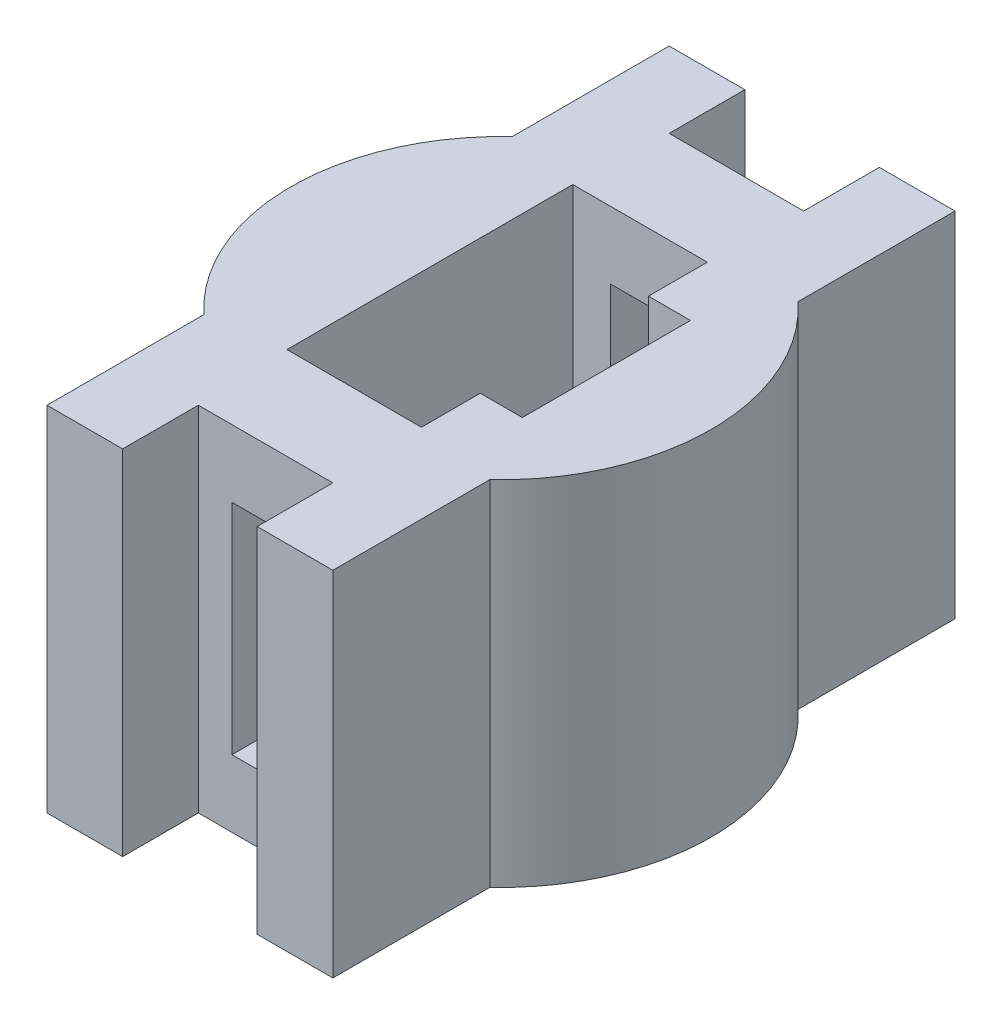
ISO-10303-21;
HEADER;
FILE_DESCRIPTION(('STEP AP214'),'2;1');
FILE_NAME('part.step','',(''),(''),'','','');
FILE_SCHEMA(('AUTOMOTIVE_DESIGN { 1 0 10303 214 1 1 1 1 }'));
ENDSEC;
DATA;
#1=APPLICATION_CONTEXT('core data for automotive mechanical design processes');
#2=APPLICATION_PROTOCOL_DEFINITION('international standard','automotive_design',2000,#1);
#3=PRODUCT_CONTEXT('',#1,'mechanical');
#4=PRODUCT('Part','Part','',(#3));
#5=PRODUCT_RELATED_PRODUCT_CATEGORY('part','',(#4));
#6=PRODUCT_DEFINITION_FORMATION('','',#4);
#7=PRODUCT_DEFINITION_CONTEXT('part definition',#1,'design');
#8=PRODUCT_DEFINITION('design','',#6,#7);
#9=PRODUCT_DEFINITION_SHAPE('','',#8);
#10=(LENGTH_UNIT() NAMED_UNIT(*) SI_UNIT(.MILLI.,.METRE.));
#11=(NAMED_UNIT(*) PLANE_ANGLE_UNIT() SI_UNIT($,.RADIAN.));
#12=(NAMED_UNIT(*) SI_UNIT($,.STERADIAN.) SOLID_ANGLE_UNIT());
#13=UNCERTAINTY_MEASURE_WITH_UNIT(LENGTH_MEASURE(1.E-05),#10,'distance_accuracy_value','');
#14=(GEOMETRIC_REPRESENTATION_CONTEXT(3) GLOBAL_UNCERTAINTY_ASSIGNED_CONTEXT((#13)) GLOBAL_UNIT_ASSIGNED_CONTEXT((#10,
#11,#12)) REPRESENTATION_CONTEXT('',''));
#15=CARTESIAN_POINT('',(0.,0.,0.));
#16=DIRECTION('',(0.,0.,1.));
#17=DIRECTION('',(1.,0.,0.));
#18=AXIS2_PLACEMENT_3D('',#15,#16,#17);
#19=CARTESIAN_POINT('',(0.,0.,37.));
#20=DIRECTION('',(1.,0.,0.));
#21=DIRECTION('',(0.,0.,-1.));
#22=AXIS2_PLACEMENT_3D('',#19,#20,#21);
#23=PLANE('',#22);
#24=DIRECTION('',(0.,-1.,0.));
#25=VECTOR('',#24,1.);
#26=CARTESIAN_POINT('',(0.,42.,18.3303027798234));
#27=LINE('',#26,#25);
#28=CARTESIAN_POINT('',(0.,0.,18.3303027798234));
#29=VERTEX_POINT('',#28);
#30=CARTESIAN_POINT('',(0.,42.,18.3303027798234));
#31=VERTEX_POINT('',#30);
#32=EDGE_CURVE('E376',#29,#31,#27,.F.);
#33=ORIENTED_EDGE('',*,*,#32,.F.);
#34=DIRECTION('',(0.,0.,-1.));
#35=VECTOR('',#34,1.);
#36=CARTESIAN_POINT('',(0.,0.,37.));
#37=LINE('',#36,#35);
#38=CARTESIAN_POINT('',(0.,0.,37.));
#39=VERTEX_POINT('',#38);
#40=EDGE_CURVE('E465',#39,#29,#37,.T.);
#41=ORIENTED_EDGE('',*,*,#40,.F.);
#42=DIRECTION('',(0.,-1.,0.));
#43=VECTOR('',#42,1.);
#44=CARTESIAN_POINT('',(0.,0.,37.));
#45=LINE('',#44,#43);
#46=CARTESIAN_POINT('',(0.,42.,37.));
#47=VERTEX_POINT('',#46);
#48=EDGE_CURVE('E427',#47,#39,#45,.T.);
#49=ORIENTED_EDGE('',*,*,#48,.F.);
#50=DIRECTION('',(0.,0.,-1.));
#51=VECTOR('',#50,1.);
#52=CARTESIAN_POINT('',(0.,42.,37.));
#53=LINE('',#52,#51);
#54=EDGE_CURVE('E454',#47,#31,#53,.T.);
#55=ORIENTED_EDGE('',*,*,#54,.T.);
#56=EDGE_LOOP('',(#33,#41,#49,#55));
#57=FACE_BOUND('',#56,.T.);
#58=ADVANCED_FACE('F37',(#57),#23,.F.);
#59=DIRECTION('',(0.,-1.,0.));
#60=VECTOR('',#59,1.);
#61=CARTESIAN_POINT('',(0.,42.,-18.3303027798234));
#62=LINE('',#61,#60);
#63=CARTESIAN_POINT('',(0.,42.,-18.3303027798234));
#64=VERTEX_POINT('',#63);
#65=CARTESIAN_POINT('',(0.,0.,-18.3303027798234));
#66=VERTEX_POINT('',#65);
#67=EDGE_CURVE('E373',#64,#66,#62,.T.);
#68=ORIENTED_EDGE('',*,*,#67,.F.);
#69=CARTESIAN_POINT('',(0.,42.,-37.));
#70=VERTEX_POINT('',#69);
#71=EDGE_CURVE('E441',#64,#70,#53,.T.);
#72=ORIENTED_EDGE('',*,*,#71,.T.);
#73=DIRECTION('',(0.,-1.,0.));
#74=VECTOR('',#73,1.);
#75=CARTESIAN_POINT('',(0.,0.,-37.));
#76=LINE('',#75,#74);
#77=CARTESIAN_POINT('',(0.,0.,-37.));
#78=VERTEX_POINT('',#77);
#79=EDGE_CURVE('E420',#70,#78,#76,.T.);
#80=ORIENTED_EDGE('',*,*,#79,.T.);
#81=EDGE_CURVE('E464',#66,#78,#37,.T.);
#82=ORIENTED_EDGE('',*,*,#81,.F.);
#83=EDGE_LOOP('',(#68,#72,#80,#82));
#84=FACE_BOUND('',#83,.T.);
#85=ADVANCED_FACE('F509',(#84),#23,.F.);
#86=CARTESIAN_POINT('',(34.,0.,37.));
#87=DIRECTION('',(-1.,0.,0.));
#88=DIRECTION('',(0.,0.,1.));
#89=AXIS2_PLACEMENT_3D('',#86,#87,#88);
#90=PLANE('',#89);
#91=DIRECTION('',(0.,-1.,0.));
#92=VECTOR('',#91,1.);
#93=CARTESIAN_POINT('',(34.,42.,-18.3303027798234));
#94=LINE('',#93,#92);
#95=CARTESIAN_POINT('',(34.,0.,-18.3303027798234));
#96=VERTEX_POINT('',#95);
#97=CARTESIAN_POINT('',(34.,42.,-18.3303027798234));
#98=VERTEX_POINT('',#97);
#99=EDGE_CURVE('E370',#96,#98,#94,.F.);
#100=ORIENTED_EDGE('',*,*,#99,.F.);
#101=DIRECTION('',(0.,0.,-1.));
#102=VECTOR('',#101,1.);
#103=CARTESIAN_POINT('',(34.,0.,37.));
#104=LINE('',#103,#102);
#105=CARTESIAN_POINT('',(34.,0.,-37.));
#106=VERTEX_POINT('',#105);
#107=EDGE_CURVE('E461',#96,#106,#104,.T.);
#108=ORIENTED_EDGE('',*,*,#107,.T.);
#109=DIRECTION('',(0.,1.,0.));
#110=VECTOR('',#109,1.);
#111=CARTESIAN_POINT('',(34.,0.,-37.));
#112=LINE('',#111,#110);
#113=CARTESIAN_POINT('',(34.,42.,-37.));
#114=VERTEX_POINT('',#113);
#115=EDGE_CURVE('E448',#106,#114,#112,.T.);
#116=ORIENTED_EDGE('',*,*,#115,.T.);
#117=DIRECTION('',(0.,0.,-1.));
#118=VECTOR('',#117,1.);
#119=CARTESIAN_POINT('',(34.,42.,37.));
#120=LINE('',#119,#118);
#121=EDGE_CURVE('E457',#98,#114,#120,.T.);
#122=ORIENTED_EDGE('',*,*,#121,.F.);
#123=EDGE_LOOP('',(#100,#108,#116,#122));
#124=FACE_BOUND('',#123,.T.);
#125=ADVANCED_FACE('F514',(#124),#90,.F.);
#126=DIRECTION('',(0.,-1.,0.));
#127=VECTOR('',#126,1.);
#128=CARTESIAN_POINT('',(34.,42.,18.3303027798234));
#129=LINE('',#128,#127);
#130=CARTESIAN_POINT('',(34.,42.,18.3303027798234));
#131=VERTEX_POINT('',#130);
#132=CARTESIAN_POINT('',(34.,0.,18.3303027798234));
#133=VERTEX_POINT('',#132);
#134=EDGE_CURVE('E363',#131,#133,#129,.T.);
#135=ORIENTED_EDGE('',*,*,#134,.F.);
#136=CARTESIAN_POINT('',(34.,42.,37.));
#137=VERTEX_POINT('',#136);
#138=EDGE_CURVE('E458',#137,#131,#120,.T.);
#139=ORIENTED_EDGE('',*,*,#138,.F.);
#140=DIRECTION('',(0.,1.,0.));
#141=VECTOR('',#140,1.);
#142=CARTESIAN_POINT('',(34.,0.,37.));
#143=LINE('',#142,#141);
#144=CARTESIAN_POINT('',(34.,0.,37.));
#145=VERTEX_POINT('',#144);
#146=EDGE_CURVE('E435',#145,#137,#143,.T.);
#147=ORIENTED_EDGE('',*,*,#146,.F.);
#148=EDGE_CURVE('E462',#145,#133,#104,.T.);
#149=ORIENTED_EDGE('',*,*,#148,.T.);
#150=EDGE_LOOP('',(#135,#139,#147,#149));
#151=FACE_BOUND('',#150,.T.);
#152=ADVANCED_FACE('F571',(#151),#90,.F.);
#153=CARTESIAN_POINT('',(0.,0.,-37.));
#154=DIRECTION('',(0.,0.,-1.));
#155=DIRECTION('',(-1.,0.,0.));
#156=AXIS2_PLACEMENT_3D('',#153,#154,#155);
#157=PLANE('',#156);
#158=DIRECTION('',(0.,1.,0.));
#159=VECTOR('',#158,1.);
#160=CARTESIAN_POINT('',(9.,0.,-37.));
#161=LINE('',#160,#159);
#162=CARTESIAN_POINT('',(9.,0.,-37.));
#163=VERTEX_POINT('',#162);
#164=CARTESIAN_POINT('',(9.,42.,-37.));
#165=VERTEX_POINT('',#164);
#166=EDGE_CURVE('E382',#163,#165,#161,.T.);
#167=ORIENTED_EDGE('',*,*,#166,.F.);
#168=DIRECTION('',(1.,0.,0.));
#169=VECTOR('',#168,1.);
#170=CARTESIAN_POINT('',(0.,0.,-37.));
#171=LINE('',#170,#169);
#172=EDGE_CURVE('E445',#78,#163,#171,.T.);
#173=ORIENTED_EDGE('',*,*,#172,.F.);
#174=ORIENTED_EDGE('',*,*,#79,.F.);
#175=DIRECTION('',(-1.,0.,0.));
#176=VECTOR('',#175,1.);
#177=CARTESIAN_POINT('',(0.,42.,-37.));
#178=LINE('',#177,#176);
#179=EDGE_CURVE('E451',#165,#70,#178,.T.);
#180=ORIENTED_EDGE('',*,*,#179,.F.);
#181=EDGE_LOOP('',(#167,#173,#174,#180));
#182=FACE_BOUND('',#181,.T.);
#183=ADVANCED_FACE('F542',(#182),#157,.T.);
#184=CARTESIAN_POINT('',(0.,0.,37.));
#185=DIRECTION('',(0.,0.,-1.));
#186=DIRECTION('',(-1.,0.,0.));
#187=AXIS2_PLACEMENT_3D('',#184,#185,#186);
#188=PLANE('',#187);
#189=DIRECTION('',(-1.,0.,0.));
#190=VECTOR('',#189,1.);
#191=CARTESIAN_POINT('',(0.,42.,37.));
#192=LINE('',#191,#190);
#193=CARTESIAN_POINT('',(25.,42.,37.));
#194=VERTEX_POINT('',#193);
#195=EDGE_CURVE('E438',#137,#194,#192,.T.);
#196=ORIENTED_EDGE('',*,*,#195,.T.);
#197=DIRECTION('',(0.,1.,0.));
#198=VECTOR('',#197,1.);
#199=CARTESIAN_POINT('',(25.,0.,37.));
#200=LINE('',#199,#198);
#201=CARTESIAN_POINT('',(25.,0.,37.));
#202=VERTEX_POINT('',#201);
#203=EDGE_CURVE('E406',#202,#194,#200,.T.);
#204=ORIENTED_EDGE('',*,*,#203,.F.);
#205=DIRECTION('',(1.,0.,0.));
#206=VECTOR('',#205,1.);
#207=CARTESIAN_POINT('',(0.,0.,37.));
#208=LINE('',#207,#206);
#209=EDGE_CURVE('E430',#202,#145,#208,.T.);
#210=ORIENTED_EDGE('',*,*,#209,.T.);
#211=ORIENTED_EDGE('',*,*,#146,.T.);
#212=EDGE_LOOP('',(#196,#204,#210,#211));
#213=FACE_BOUND('',#212,.T.);
#214=ADVANCED_FACE('F576',(#213),#188,.F.);
#215=CARTESIAN_POINT('',(0.,0.,37.));
#216=DIRECTION('',(0.,1.,0.));
#217=DIRECTION('',(0.,0.,1.));
#218=AXIS2_PLACEMENT_3D('',#215,#216,#217);
#219=PLANE('',#218);
#220=DIRECTION('',(-1.,0.,0.));
#221=VECTOR('',#220,1.);
#222=CARTESIAN_POINT('',(24.5377617402465,0.,-17.));
#223=LINE('',#222,#221);
#224=CARTESIAN_POINT('',(24.5377617402465,0.,-17.));
#225=VERTEX_POINT('',#224);
#226=CARTESIAN_POINT('',(8.53776174024647,0.,-17.));
#227=VERTEX_POINT('',#226);
#228=EDGE_CURVE('E336',#225,#227,#223,.T.);
#229=ORIENTED_EDGE('',*,*,#228,.T.);
#230=DIRECTION('',(0.,0.,1.));
#231=VECTOR('',#230,1.);
#232=CARTESIAN_POINT('',(8.53776174024647,0.,17.));
#233=LINE('',#232,#231);
#234=CARTESIAN_POINT('',(8.53776174024647,0.,17.));
#235=VERTEX_POINT('',#234);
#236=EDGE_CURVE('E326',#227,#235,#233,.T.);
#237=ORIENTED_EDGE('',*,*,#236,.T.);
#238=DIRECTION('',(1.,0.,0.));
#239=VECTOR('',#238,1.);
#240=CARTESIAN_POINT('',(24.5377617402465,0.,17.));
#241=LINE('',#240,#239);
#242=CARTESIAN_POINT('',(24.5377617402465,0.,17.));
#243=VERTEX_POINT('',#242);
#244=EDGE_CURVE('E329',#235,#243,#241,.T.);
#245=ORIENTED_EDGE('',*,*,#244,.T.);
#246=DIRECTION('',(0.,0.,-1.));
#247=VECTOR('',#246,1.);
#248=CARTESIAN_POINT('',(24.5377617402465,0.,17.));
#249=LINE('',#248,#247);
#250=EDGE_CURVE('E333',#243,#225,#249,.T.);
#251=ORIENTED_EDGE('',*,*,#250,.T.);
#252=EDGE_LOOP('',(#229,#237,#245,#251));
#253=FACE_BOUND('',#252,.T.);
#254=ORIENTED_EDGE('',*,*,#40,.T.);
#255=CARTESIAN_POINT('',(17.,0.,0.));
#256=DIRECTION('',(0.,1.,0.));
#257=DIRECTION('',(0.,0.,1.));
#258=AXIS2_PLACEMENT_3D('',#255,#256,#257);
#259=CIRCLE('',#258,25.);
#260=EDGE_CURVE('E352',#66,#29,#259,.T.);
#261=ORIENTED_EDGE('',*,*,#260,.F.);
#262=ORIENTED_EDGE('',*,*,#81,.T.);
#263=ORIENTED_EDGE('',*,*,#172,.T.);
#264=DIRECTION('',(0.,0.,-1.));
#265=VECTOR('',#264,1.);
#266=CARTESIAN_POINT('',(9.,0.,-28.));
#267=LINE('',#266,#265);
#268=CARTESIAN_POINT('',(9.,0.,-28.));
#269=VERTEX_POINT('',#268);
#270=EDGE_CURVE('E397',#269,#163,#267,.T.);
#271=ORIENTED_EDGE('',*,*,#270,.F.);
#272=DIRECTION('',(-1.,0.,0.));
#273=VECTOR('',#272,1.);
#274=CARTESIAN_POINT('',(25.,0.,-28.));
#275=LINE('',#274,#273);
#276=CARTESIAN_POINT('',(25.,0.,-28.));
#277=VERTEX_POINT('',#276);
#278=EDGE_CURVE('E385',#277,#269,#275,.T.);
#279=ORIENTED_EDGE('',*,*,#278,.F.);
#280=DIRECTION('',(0.,0.,-1.));
#281=VECTOR('',#280,1.);
#282=CARTESIAN_POINT('',(25.,0.,-28.));
#283=LINE('',#282,#281);
#284=CARTESIAN_POINT('',(25.,0.,-37.));
#285=VERTEX_POINT('',#284);
#286=EDGE_CURVE('E399',#277,#285,#283,.T.);
#287=ORIENTED_EDGE('',*,*,#286,.T.);
#288=EDGE_CURVE('E444',#285,#106,#171,.T.);
#289=ORIENTED_EDGE('',*,*,#288,.T.);
#290=ORIENTED_EDGE('',*,*,#107,.F.);
#291=EDGE_CURVE('E365',#133,#96,#259,.T.);
#292=ORIENTED_EDGE('',*,*,#291,.F.);
#293=ORIENTED_EDGE('',*,*,#148,.F.);
#294=ORIENTED_EDGE('',*,*,#209,.F.);
#295=DIRECTION('',(0.,0.,1.));
#296=VECTOR('',#295,1.);
#297=CARTESIAN_POINT('',(25.,0.,28.));
#298=LINE('',#297,#296);
#299=CARTESIAN_POINT('',(25.,0.,28.));
#300=VERTEX_POINT('',#299);
#301=EDGE_CURVE('E421',#300,#202,#298,.T.);
#302=ORIENTED_EDGE('',*,*,#301,.F.);
#303=DIRECTION('',(1.,0.,0.));
#304=VECTOR('',#303,1.);
#305=CARTESIAN_POINT('',(9.00000000000001,0.,28.));
#306=LINE('',#305,#304);
#307=CARTESIAN_POINT('',(9.00000000000001,0.,28.));
#308=VERTEX_POINT('',#307);
#309=EDGE_CURVE('E409',#308,#300,#306,.T.);
#310=ORIENTED_EDGE('',*,*,#309,.F.);
#311=DIRECTION('',(0.,0.,1.));
#312=VECTOR('',#311,1.);
#313=CARTESIAN_POINT('',(9.00000000000001,0.,28.));
#314=LINE('',#313,#312);
#315=CARTESIAN_POINT('',(9.00000000000001,0.,37.));
#316=VERTEX_POINT('',#315);
#317=EDGE_CURVE('E423',#308,#316,#314,.T.);
#318=ORIENTED_EDGE('',*,*,#317,.T.);
#319=EDGE_CURVE('E432',#39,#316,#208,.T.);
#320=ORIENTED_EDGE('',*,*,#319,.F.);
#321=EDGE_LOOP('',(#254,#261,#262,#263,#271,#279,#287,#289,#290,#292,#293,#294,#302,#310,#318,#320));
#322=FACE_BOUND('',#321,.T.);
#323=ADVANCED_FACE('F523',(#253,#322),#219,.F.);
#324=CARTESIAN_POINT('',(0.,42.,37.));
#325=DIRECTION('',(0.,-1.,0.));
#326=DIRECTION('',(0.,0.,-1.));
#327=AXIS2_PLACEMENT_3D('',#324,#325,#326);
#328=PLANE('',#327);
#329=DIRECTION('',(0.,0.,-1.));
#330=VECTOR('',#329,1.);
#331=CARTESIAN_POINT('',(29.5377617402465,42.,10.));
#332=LINE('',#331,#330);
#333=CARTESIAN_POINT('',(29.5377617402465,42.,10.));
#334=VERTEX_POINT('',#333);
#335=CARTESIAN_POINT('',(29.5377617402465,42.,-10.));
#336=VERTEX_POINT('',#335);
#337=EDGE_CURVE('E298',#334,#336,#332,.T.);
#338=ORIENTED_EDGE('',*,*,#337,.F.);
#339=DIRECTION('',(-1.,0.,0.));
#340=VECTOR('',#339,1.);
#341=CARTESIAN_POINT('',(29.5377617402465,42.,10.));
#342=LINE('',#341,#340);
#343=CARTESIAN_POINT('',(24.5377617402465,42.,10.));
#344=VERTEX_POINT('',#343);
#345=EDGE_CURVE('E317',#334,#344,#342,.T.);
#346=ORIENTED_EDGE('',*,*,#345,.T.);
#347=DIRECTION('',(0.,0.,-1.));
#348=VECTOR('',#347,1.);
#349=CARTESIAN_POINT('',(24.5377617402465,42.,17.));
#350=LINE('',#349,#348);
#351=CARTESIAN_POINT('',(24.5377617402465,42.,17.));
#352=VERTEX_POINT('',#351);
#353=EDGE_CURVE('E345',#352,#344,#350,.T.);
#354=ORIENTED_EDGE('',*,*,#353,.F.);
#355=DIRECTION('',(1.,0.,0.));
#356=VECTOR('',#355,1.);
#357=CARTESIAN_POINT('',(24.5377617402465,42.,17.));
#358=LINE('',#357,#356);
#359=CARTESIAN_POINT('',(8.53776174024647,42.,17.));
#360=VERTEX_POINT('',#359);
#361=EDGE_CURVE('E341',#360,#352,#358,.T.);
#362=ORIENTED_EDGE('',*,*,#361,.F.);
#363=DIRECTION('',(0.,0.,1.));
#364=VECTOR('',#363,1.);
#365=CARTESIAN_POINT('',(8.53776174024647,42.,17.));
#366=LINE('',#365,#364);
#367=CARTESIAN_POINT('',(8.53776174024647,42.,-17.));
#368=VERTEX_POINT('',#367);
#369=EDGE_CURVE('E320',#368,#360,#366,.T.);
#370=ORIENTED_EDGE('',*,*,#369,.F.);
#371=DIRECTION('',(-1.,0.,0.));
#372=VECTOR('',#371,1.);
#373=CARTESIAN_POINT('',(24.5377617402465,42.,-17.));
#374=LINE('',#373,#372);
#375=CARTESIAN_POINT('',(24.5377617402465,42.,-17.));
#376=VERTEX_POINT('',#375);
#377=EDGE_CURVE('E330',#376,#368,#374,.T.);
#378=ORIENTED_EDGE('',*,*,#377,.F.);
#379=CARTESIAN_POINT('',(24.5377617402465,42.,-10.));
#380=VERTEX_POINT('',#379);
#381=EDGE_CURVE('E344',#380,#376,#350,.T.);
#382=ORIENTED_EDGE('',*,*,#381,.F.);
#383=DIRECTION('',(-1.,0.,0.));
#384=VECTOR('',#383,1.);
#385=CARTESIAN_POINT('',(29.5377617402465,42.,-10.));
#386=LINE('',#385,#384);
#387=EDGE_CURVE('E310',#336,#380,#386,.T.);
#388=ORIENTED_EDGE('',*,*,#387,.F.);
#389=EDGE_LOOP('',(#338,#346,#354,#362,#370,#378,#382,#388));
#390=FACE_BOUND('',#389,.T.);
#391=ORIENTED_EDGE('',*,*,#71,.F.);
#392=CARTESIAN_POINT('',(17.,42.,0.));
#393=DIRECTION('',(0.,1.,0.));
#394=DIRECTION('',(0.,0.,1.));
#395=AXIS2_PLACEMENT_3D('',#392,#393,#394);
#396=CIRCLE('',#395,25.);
#397=EDGE_CURVE('E364',#64,#31,#396,.T.);
#398=ORIENTED_EDGE('',*,*,#397,.T.);
#399=ORIENTED_EDGE('',*,*,#54,.F.);
#400=CARTESIAN_POINT('',(9.,42.,37.));
#401=VERTEX_POINT('',#400);
#402=EDGE_CURVE('E437',#401,#47,#192,.T.);
#403=ORIENTED_EDGE('',*,*,#402,.F.);
#404=DIRECTION('',(0.,0.,1.));
#405=VECTOR('',#404,1.);
#406=CARTESIAN_POINT('',(9.,42.,28.));
#407=LINE('',#406,#405);
#408=CARTESIAN_POINT('',(9.,42.,28.));
#409=VERTEX_POINT('',#408);
#410=EDGE_CURVE('E414',#409,#401,#407,.T.);
#411=ORIENTED_EDGE('',*,*,#410,.F.);
#412=DIRECTION('',(-1.,0.,0.));
#413=VECTOR('',#412,1.);
#414=CARTESIAN_POINT('',(25.,42.,28.));
#415=LINE('',#414,#413);
#416=CARTESIAN_POINT('',(25.,42.,28.));
#417=VERTEX_POINT('',#416);
#418=EDGE_CURVE('E403',#417,#409,#415,.T.);
#419=ORIENTED_EDGE('',*,*,#418,.F.);
#420=DIRECTION('',(0.,0.,1.));
#421=VECTOR('',#420,1.);
#422=CARTESIAN_POINT('',(25.,42.,28.));
#423=LINE('',#422,#421);
#424=EDGE_CURVE('E417',#417,#194,#423,.T.);
#425=ORIENTED_EDGE('',*,*,#424,.T.);
#426=ORIENTED_EDGE('',*,*,#195,.F.);
#427=ORIENTED_EDGE('',*,*,#138,.T.);
#428=EDGE_CURVE('E360',#131,#98,#396,.T.);
#429=ORIENTED_EDGE('',*,*,#428,.T.);
#430=ORIENTED_EDGE('',*,*,#121,.T.);
#431=CARTESIAN_POINT('',(25.,42.,-37.));
#432=VERTEX_POINT('',#431);
#433=EDGE_CURVE('E431',#114,#432,#178,.T.);
#434=ORIENTED_EDGE('',*,*,#433,.T.);
#435=DIRECTION('',(0.,0.,-1.));
#436=VECTOR('',#435,1.);
#437=CARTESIAN_POINT('',(25.,42.,-28.));
#438=LINE('',#437,#436);
#439=CARTESIAN_POINT('',(25.,42.,-28.));
#440=VERTEX_POINT('',#439);
#441=EDGE_CURVE('E390',#440,#432,#438,.T.);
#442=ORIENTED_EDGE('',*,*,#441,.F.);
#443=DIRECTION('',(1.,0.,0.));
#444=VECTOR('',#443,1.);
#445=CARTESIAN_POINT('',(9.,42.,-28.));
#446=LINE('',#445,#444);
#447=CARTESIAN_POINT('',(9.,42.,-28.));
#448=VERTEX_POINT('',#447);
#449=EDGE_CURVE('E379',#448,#440,#446,.T.);
#450=ORIENTED_EDGE('',*,*,#449,.F.);
#451=DIRECTION('',(0.,0.,-1.));
#452=VECTOR('',#451,1.);
#453=CARTESIAN_POINT('',(9.,42.,-28.));
#454=LINE('',#453,#452);
#455=EDGE_CURVE('E393',#448,#165,#454,.T.);
#456=ORIENTED_EDGE('',*,*,#455,.T.);
#457=ORIENTED_EDGE('',*,*,#179,.T.);
#458=EDGE_LOOP('',(#391,#398,#399,#403,#411,#419,#425,#426,#427,#429,#430,#434,#442,#450,#456,#457));
#459=FACE_BOUND('',#458,.T.);
#460=ADVANCED_FACE('F532',(#390,#459),#328,.F.);
#461=ORIENTED_EDGE('',*,*,#319,.T.);
#462=DIRECTION('',(0.,-1.,0.));
#463=VECTOR('',#462,1.);
#464=CARTESIAN_POINT('',(9.,42.,37.));
#465=LINE('',#464,#463);
#466=EDGE_CURVE('E396',#401,#316,#465,.T.);
#467=ORIENTED_EDGE('',*,*,#466,.F.);
#468=ORIENTED_EDGE('',*,*,#402,.T.);
#469=ORIENTED_EDGE('',*,*,#48,.T.);
#470=EDGE_LOOP('',(#461,#467,#468,#469));
#471=FACE_BOUND('',#470,.T.);
#472=ADVANCED_FACE('F527',(#471),#188,.F.);
#473=DIRECTION('',(0.,-1.,0.));
#474=VECTOR('',#473,1.);
#475=CARTESIAN_POINT('',(25.,42.,-37.));
#476=LINE('',#475,#474);
#477=EDGE_CURVE('E378',#432,#285,#476,.T.);
#478=ORIENTED_EDGE('',*,*,#477,.F.);
#479=ORIENTED_EDGE('',*,*,#433,.F.);
#480=ORIENTED_EDGE('',*,*,#115,.F.);
#481=ORIENTED_EDGE('',*,*,#288,.F.);
#482=EDGE_LOOP('',(#478,#479,#480,#481));
#483=FACE_BOUND('',#482,.T.);
#484=ADVANCED_FACE('F558',(#483),#157,.T.);
#485=CARTESIAN_POINT('',(25.,0.,28.));
#486=DIRECTION('',(1.,0.,0.));
#487=DIRECTION('',(0.,0.,-1.));
#488=AXIS2_PLACEMENT_3D('',#485,#486,#487);
#489=PLANE('',#488);
#490=ORIENTED_EDGE('',*,*,#203,.T.);
#491=ORIENTED_EDGE('',*,*,#424,.F.);
#492=DIRECTION('',(0.,1.,0.));
#493=VECTOR('',#492,1.);
#494=CARTESIAN_POINT('',(25.,0.,28.));
#495=LINE('',#494,#493);
#496=EDGE_CURVE('E411',#300,#417,#495,.T.);
#497=ORIENTED_EDGE('',*,*,#496,.F.);
#498=ORIENTED_EDGE('',*,*,#301,.T.);
#499=EDGE_LOOP('',(#490,#491,#497,#498));
#500=FACE_BOUND('',#499,.T.);
#501=ADVANCED_FACE('F580',(#500),#489,.F.);
#502=CARTESIAN_POINT('',(9.,42.,28.));
#503=DIRECTION('',(-1.,0.,0.));
#504=DIRECTION('',(0.,-1.,0.));
#505=AXIS2_PLACEMENT_3D('',#502,#503,#504);
#506=PLANE('',#505);
#507=ORIENTED_EDGE('',*,*,#466,.T.);
#508=ORIENTED_EDGE('',*,*,#317,.F.);
#509=DIRECTION('',(0.,-1.,0.));
#510=VECTOR('',#509,1.);
#511=CARTESIAN_POINT('',(9.,42.,28.));
#512=LINE('',#511,#510);
#513=EDGE_CURVE('E405',#409,#308,#512,.T.);
#514=ORIENTED_EDGE('',*,*,#513,.F.);
#515=ORIENTED_EDGE('',*,*,#410,.T.);
#516=EDGE_LOOP('',(#507,#508,#514,#515));
#517=FACE_BOUND('',#516,.T.);
#518=ADVANCED_FACE('F583',(#517),#506,.F.);
#519=CARTESIAN_POINT('',(0.,0.,28.));
#520=DIRECTION('',(0.,0.,1.));
#521=DIRECTION('',(1.,0.,0.));
#522=AXIS2_PLACEMENT_3D('',#519,#520,#521);
#523=PLANE('',#522);
#524=DIRECTION('',(0.,1.,0.));
#525=VECTOR('',#524,1.);
#526=CARTESIAN_POINT('',(21.,0.,28.));
#527=LINE('',#526,#525);
#528=CARTESIAN_POINT('',(21.,8.,28.));
#529=VERTEX_POINT('',#528);
#530=CARTESIAN_POINT('',(21.,34.,28.));
#531=VERTEX_POINT('',#530);
#532=EDGE_CURVE('E295',#529,#531,#527,.T.);
#533=ORIENTED_EDGE('',*,*,#532,.F.);
#534=DIRECTION('',(1.,0.,0.));
#535=VECTOR('',#534,1.);
#536=CARTESIAN_POINT('',(0.,8.,28.));
#537=LINE('',#536,#535);
#538=CARTESIAN_POINT('',(13.,8.,28.));
#539=VERTEX_POINT('',#538);
#540=EDGE_CURVE('E282',#539,#529,#537,.T.);
#541=ORIENTED_EDGE('',*,*,#540,.F.);
#542=DIRECTION('',(0.,-1.,0.));
#543=VECTOR('',#542,1.);
#544=CARTESIAN_POINT('',(13.,0.,28.));
#545=LINE('',#544,#543);
#546=CARTESIAN_POINT('',(13.,34.,28.));
#547=VERTEX_POINT('',#546);
#548=EDGE_CURVE('E285',#547,#539,#545,.T.);
#549=ORIENTED_EDGE('',*,*,#548,.F.);
#550=DIRECTION('',(-1.,0.,0.));
#551=VECTOR('',#550,1.);
#552=CARTESIAN_POINT('',(0.,34.,28.));
#553=LINE('',#552,#551);
#554=EDGE_CURVE('E290',#531,#547,#553,.T.);
#555=ORIENTED_EDGE('',*,*,#554,.F.);
#556=EDGE_LOOP('',(#533,#541,#549,#555));
#557=FACE_BOUND('',#556,.T.);
#558=ORIENTED_EDGE('',*,*,#418,.T.);
#559=ORIENTED_EDGE('',*,*,#513,.T.);
#560=ORIENTED_EDGE('',*,*,#309,.T.);
#561=ORIENTED_EDGE('',*,*,#496,.T.);
#562=EDGE_LOOP('',(#558,#559,#560,#561));
#563=FACE_BOUND('',#562,.T.);
#564=ADVANCED_FACE('F491',(#557,#563),#523,.T.);
#565=CARTESIAN_POINT('',(9.,0.,-28.));
#566=DIRECTION('',(-1.,0.,0.));
#567=DIRECTION('',(0.,0.,1.));
#568=AXIS2_PLACEMENT_3D('',#565,#566,#567);
#569=PLANE('',#568);
#570=ORIENTED_EDGE('',*,*,#166,.T.);
#571=ORIENTED_EDGE('',*,*,#455,.F.);
#572=DIRECTION('',(0.,1.,0.));
#573=VECTOR('',#572,1.);
#574=CARTESIAN_POINT('',(9.,0.,-28.));
#575=LINE('',#574,#573);
#576=EDGE_CURVE('E387',#269,#448,#575,.T.);
#577=ORIENTED_EDGE('',*,*,#576,.F.);
#578=ORIENTED_EDGE('',*,*,#270,.T.);
#579=EDGE_LOOP('',(#570,#571,#577,#578));
#580=FACE_BOUND('',#579,.T.);
#581=ADVANCED_FACE('F545',(#580),#569,.F.);
#582=CARTESIAN_POINT('',(25.,42.,-28.));
#583=DIRECTION('',(1.,0.,0.));
#584=DIRECTION('',(0.,0.,-1.));
#585=AXIS2_PLACEMENT_3D('',#582,#583,#584);
#586=PLANE('',#585);
#587=ORIENTED_EDGE('',*,*,#477,.T.);
#588=ORIENTED_EDGE('',*,*,#286,.F.);
#589=DIRECTION('',(0.,-1.,0.));
#590=VECTOR('',#589,1.);
#591=CARTESIAN_POINT('',(25.,42.,-28.));
#592=LINE('',#591,#590);
#593=EDGE_CURVE('E381',#440,#277,#592,.T.);
#594=ORIENTED_EDGE('',*,*,#593,.F.);
#595=ORIENTED_EDGE('',*,*,#441,.T.);
#596=EDGE_LOOP('',(#587,#588,#594,#595));
#597=FACE_BOUND('',#596,.T.);
#598=ADVANCED_FACE('F552',(#597),#586,.F.);
#599=CARTESIAN_POINT('',(0.,0.,-28.));
#600=DIRECTION('',(0.,0.,-1.));
#601=DIRECTION('',(-1.,0.,0.));
#602=AXIS2_PLACEMENT_3D('',#599,#600,#601);
#603=PLANE('',#602);
#604=DIRECTION('',(0.,-1.,0.));
#605=VECTOR('',#604,1.);
#606=CARTESIAN_POINT('',(21.,8.,-28.));
#607=LINE('',#606,#605);
#608=CARTESIAN_POINT('',(21.,34.,-28.));
#609=VERTEX_POINT('',#608);
#610=CARTESIAN_POINT('',(21.,8.,-28.));
#611=VERTEX_POINT('',#610);
#612=EDGE_CURVE('E59',#609,#611,#607,.T.);
#613=ORIENTED_EDGE('',*,*,#612,.F.);
#614=DIRECTION('',(1.,0.,0.));
#615=VECTOR('',#614,1.);
#616=CARTESIAN_POINT('',(21.,34.,-28.));
#617=LINE('',#616,#615);
#618=CARTESIAN_POINT('',(13.,34.,-28.));
#619=VERTEX_POINT('',#618);
#620=EDGE_CURVE('E268',#619,#609,#617,.T.);
#621=ORIENTED_EDGE('',*,*,#620,.F.);
#622=DIRECTION('',(0.,1.,0.));
#623=VECTOR('',#622,1.);
#624=CARTESIAN_POINT('',(13.,34.,-28.));
#625=LINE('',#624,#623);
#626=CARTESIAN_POINT('',(13.,8.,-28.));
#627=VERTEX_POINT('',#626);
#628=EDGE_CURVE('E251',#627,#619,#625,.T.);
#629=ORIENTED_EDGE('',*,*,#628,.F.);
#630=DIRECTION('',(-1.,0.,0.));
#631=VECTOR('',#630,1.);
#632=CARTESIAN_POINT('',(13.,8.,-28.));
#633=LINE('',#632,#631);
#634=EDGE_CURVE('E260',#611,#627,#633,.T.);
#635=ORIENTED_EDGE('',*,*,#634,.F.);
#636=EDGE_LOOP('',(#613,#621,#629,#635));
#637=FACE_BOUND('',#636,.T.);
#638=ORIENTED_EDGE('',*,*,#449,.T.);
#639=ORIENTED_EDGE('',*,*,#593,.T.);
#640=ORIENTED_EDGE('',*,*,#278,.T.);
#641=ORIENTED_EDGE('',*,*,#576,.T.);
#642=EDGE_LOOP('',(#638,#639,#640,#641));
#643=FACE_BOUND('',#642,.T.);
#644=ADVANCED_FACE('F265',(#637,#643),#603,.T.);
#645=CARTESIAN_POINT('',(17.,42.,0.));
#646=DIRECTION('',(0.,-1.,0.));
#647=DIRECTION('',(0.,0.,-1.));
#648=AXIS2_PLACEMENT_3D('',#645,#646,#647);
#649=CYLINDRICAL_SURFACE('',#648,25.);
#650=ORIENTED_EDGE('',*,*,#291,.T.);
#651=ORIENTED_EDGE('',*,*,#99,.T.);
#652=ORIENTED_EDGE('',*,*,#428,.F.);
#653=ORIENTED_EDGE('',*,*,#134,.T.);
#654=EDGE_LOOP('',(#650,#651,#652,#653));
#655=FACE_BOUND('',#654,.T.);
#656=ADVANCED_FACE('F567',(#655),#649,.T.);
#657=ORIENTED_EDGE('',*,*,#260,.T.);
#658=ORIENTED_EDGE('',*,*,#32,.T.);
#659=ORIENTED_EDGE('',*,*,#397,.F.);
#660=ORIENTED_EDGE('',*,*,#67,.T.);
#661=EDGE_LOOP('',(#657,#658,#659,#660));
#662=FACE_BOUND('',#661,.T.);
#663=ADVANCED_FACE('F535',(#662),#649,.T.);
#664=CARTESIAN_POINT('',(8.53776174024647,0.,17.));
#665=DIRECTION('',(-1.,0.,0.));
#666=DIRECTION('',(0.,0.,1.));
#667=AXIS2_PLACEMENT_3D('',#664,#665,#666);
#668=PLANE('',#667);
#669=ORIENTED_EDGE('',*,*,#369,.T.);
#670=DIRECTION('',(0.,1.,0.));
#671=VECTOR('',#670,1.);
#672=CARTESIAN_POINT('',(8.53776174024647,0.,17.));
#673=LINE('',#672,#671);
#674=EDGE_CURVE('E339',#235,#360,#673,.T.);
#675=ORIENTED_EDGE('',*,*,#674,.F.);
#676=ORIENTED_EDGE('',*,*,#236,.F.);
#677=DIRECTION('',(0.,1.,0.));
#678=VECTOR('',#677,1.);
#679=CARTESIAN_POINT('',(8.53776174024647,0.,-17.));
#680=LINE('',#679,#678);
#681=EDGE_CURVE('E350',#227,#368,#680,.T.);
#682=ORIENTED_EDGE('',*,*,#681,.T.);
#683=EDGE_LOOP('',(#669,#675,#676,#682));
#684=FACE_BOUND('',#683,.T.);
#685=ADVANCED_FACE('F613',(#684),#668,.F.);
#686=CARTESIAN_POINT('',(24.5377617402465,0.,-17.));
#687=DIRECTION('',(0.,0.,-1.));
#688=DIRECTION('',(-1.,0.,0.));
#689=AXIS2_PLACEMENT_3D('',#686,#687,#688);
#690=PLANE('',#689);
#691=DIRECTION('',(1.,0.,0.));
#692=VECTOR('',#691,1.);
#693=CARTESIAN_POINT('',(24.5377617402465,34.,-17.));
#694=LINE('',#693,#692);
#695=CARTESIAN_POINT('',(13.,34.,-17.));
#696=VERTEX_POINT('',#695);
#697=CARTESIAN_POINT('',(21.,34.,-17.));
#698=VERTEX_POINT('',#697);
#699=EDGE_CURVE('E287',#696,#698,#694,.T.);
#700=ORIENTED_EDGE('',*,*,#699,.T.);
#701=DIRECTION('',(0.,-1.,0.));
#702=VECTOR('',#701,1.);
#703=CARTESIAN_POINT('',(21.,0.,-17.));
#704=LINE('',#703,#702);
#705=CARTESIAN_POINT('',(21.,8.,-17.));
#706=VERTEX_POINT('',#705);
#707=EDGE_CURVE('E292',#698,#706,#704,.T.);
#708=ORIENTED_EDGE('',*,*,#707,.T.);
#709=DIRECTION('',(-1.,0.,0.));
#710=VECTOR('',#709,1.);
#711=CARTESIAN_POINT('',(24.5377617402465,8.,-17.));
#712=LINE('',#711,#710);
#713=CARTESIAN_POINT('',(13.,8.,-17.));
#714=VERTEX_POINT('',#713);
#715=EDGE_CURVE('E280',#706,#714,#712,.T.);
#716=ORIENTED_EDGE('',*,*,#715,.T.);
#717=DIRECTION('',(0.,1.,0.));
#718=VECTOR('',#717,1.);
#719=CARTESIAN_POINT('',(13.,0.,-17.));
#720=LINE('',#719,#718);
#721=EDGE_CURVE('E254',#714,#696,#720,.T.);
#722=ORIENTED_EDGE('',*,*,#721,.T.);
#723=EDGE_LOOP('',(#700,#708,#716,#722));
#724=FACE_BOUND('',#723,.T.);
#725=ORIENTED_EDGE('',*,*,#377,.T.);
#726=ORIENTED_EDGE('',*,*,#681,.F.);
#727=ORIENTED_EDGE('',*,*,#228,.F.);
#728=DIRECTION('',(0.,1.,0.));
#729=VECTOR('',#728,1.);
#730=CARTESIAN_POINT('',(24.5377617402465,0.,-17.));
#731=LINE('',#730,#729);
#732=EDGE_CURVE('E353',#225,#376,#731,.T.);
#733=ORIENTED_EDGE('',*,*,#732,.T.);
#734=EDGE_LOOP('',(#725,#726,#727,#733));
#735=FACE_BOUND('',#734,.T.);
#736=ADVANCED_FACE('F609',(#724,#735),#690,.F.);
#737=CARTESIAN_POINT('',(24.5377617402465,0.,17.));
#738=DIRECTION('',(1.,0.,0.));
#739=DIRECTION('',(0.,0.,-1.));
#740=AXIS2_PLACEMENT_3D('',#737,#738,#739);
#741=PLANE('',#740);
#742=ORIENTED_EDGE('',*,*,#353,.T.);
#743=DIRECTION('',(0.,1.,0.));
#744=VECTOR('',#743,1.);
#745=CARTESIAN_POINT('',(24.5377617402465,32.,10.));
#746=LINE('',#745,#744);
#747=CARTESIAN_POINT('',(24.5377617402465,32.,10.));
#748=VERTEX_POINT('',#747);
#749=EDGE_CURVE('E301',#748,#344,#746,.T.);
#750=ORIENTED_EDGE('',*,*,#749,.F.);
#751=DIRECTION('',(0.,0.,1.));
#752=VECTOR('',#751,1.);
#753=CARTESIAN_POINT('',(24.5377617402465,32.,-10.));
#754=LINE('',#753,#752);
#755=CARTESIAN_POINT('',(24.5377617402465,32.,-10.));
#756=VERTEX_POINT('',#755);
#757=EDGE_CURVE('E313',#756,#748,#754,.T.);
#758=ORIENTED_EDGE('',*,*,#757,.F.);
#759=DIRECTION('',(0.,-1.,0.));
#760=VECTOR('',#759,1.);
#761=CARTESIAN_POINT('',(24.5377617402465,42.,-10.));
#762=LINE('',#761,#760);
#763=EDGE_CURVE('E297',#380,#756,#762,.T.);
#764=ORIENTED_EDGE('',*,*,#763,.F.);
#765=ORIENTED_EDGE('',*,*,#381,.T.);
#766=ORIENTED_EDGE('',*,*,#732,.F.);
#767=ORIENTED_EDGE('',*,*,#250,.F.);
#768=DIRECTION('',(0.,1.,0.));
#769=VECTOR('',#768,1.);
#770=CARTESIAN_POINT('',(24.5377617402465,0.,17.));
#771=LINE('',#770,#769);
#772=EDGE_CURVE('E356',#243,#352,#771,.T.);
#773=ORIENTED_EDGE('',*,*,#772,.T.);
#774=EDGE_LOOP('',(#742,#750,#758,#764,#765,#766,#767,#773));
#775=FACE_BOUND('',#774,.T.);
#776=ADVANCED_FACE('F619',(#775),#741,.F.);
#777=CARTESIAN_POINT('',(24.5377617402465,0.,17.));
#778=DIRECTION('',(0.,0.,1.));
#779=DIRECTION('',(1.,0.,0.));
#780=AXIS2_PLACEMENT_3D('',#777,#778,#779);
#781=PLANE('',#780);
#782=DIRECTION('',(1.,0.,0.));
#783=VECTOR('',#782,1.);
#784=CARTESIAN_POINT('',(24.5377617402465,8.,17.));
#785=LINE('',#784,#783);
#786=CARTESIAN_POINT('',(13.,8.,17.));
#787=VERTEX_POINT('',#786);
#788=CARTESIAN_POINT('',(21.,8.,17.));
#789=VERTEX_POINT('',#788);
#790=EDGE_CURVE('E468',#787,#789,#785,.T.);
#791=ORIENTED_EDGE('',*,*,#790,.T.);
#792=DIRECTION('',(0.,1.,0.));
#793=VECTOR('',#792,1.);
#794=CARTESIAN_POINT('',(21.,0.,17.));
#795=LINE('',#794,#793);
#796=CARTESIAN_POINT('',(21.,34.,17.));
#797=VERTEX_POINT('',#796);
#798=EDGE_CURVE('E11',#789,#797,#795,.T.);
#799=ORIENTED_EDGE('',*,*,#798,.T.);
#800=DIRECTION('',(-1.,0.,0.));
#801=VECTOR('',#800,1.);
#802=CARTESIAN_POINT('',(24.5377617402465,34.,17.));
#803=LINE('',#802,#801);
#804=CARTESIAN_POINT('',(13.,34.,17.));
#805=VERTEX_POINT('',#804);
#806=EDGE_CURVE('E44',#797,#805,#803,.T.);
#807=ORIENTED_EDGE('',*,*,#806,.T.);
#808=DIRECTION('',(0.,-1.,0.));
#809=VECTOR('',#808,1.);
#810=CARTESIAN_POINT('',(13.,0.,17.));
#811=LINE('',#810,#809);
#812=EDGE_CURVE('E471',#805,#787,#811,.T.);
#813=ORIENTED_EDGE('',*,*,#812,.T.);
#814=EDGE_LOOP('',(#791,#799,#807,#813));
#815=FACE_BOUND('',#814,.T.);
#816=ORIENTED_EDGE('',*,*,#361,.T.);
#817=ORIENTED_EDGE('',*,*,#772,.F.);
#818=ORIENTED_EDGE('',*,*,#244,.F.);
#819=ORIENTED_EDGE('',*,*,#674,.T.);
#820=EDGE_LOOP('',(#816,#817,#818,#819));
#821=FACE_BOUND('',#820,.T.);
#822=ADVANCED_FACE('F475',(#815,#821),#781,.F.);
#823=CARTESIAN_POINT('',(29.5377617402465,32.,10.));
#824=DIRECTION('',(0.,0.,1.));
#825=DIRECTION('',(0.,-1.,0.));
#826=AXIS2_PLACEMENT_3D('',#823,#824,#825);
#827=PLANE('',#826);
#828=ORIENTED_EDGE('',*,*,#749,.T.);
#829=ORIENTED_EDGE('',*,*,#345,.F.);
#830=DIRECTION('',(0.,1.,0.));
#831=VECTOR('',#830,1.);
#832=CARTESIAN_POINT('',(29.5377617402465,32.,10.));
#833=LINE('',#832,#831);
#834=CARTESIAN_POINT('',(29.5377617402465,32.,10.));
#835=VERTEX_POINT('',#834);
#836=EDGE_CURVE('E307',#835,#334,#833,.T.);
#837=ORIENTED_EDGE('',*,*,#836,.F.);
#838=DIRECTION('',(-1.,0.,0.));
#839=VECTOR('',#838,1.);
#840=CARTESIAN_POINT('',(29.5377617402465,32.,10.));
#841=LINE('',#840,#839);
#842=EDGE_CURVE('E321',#835,#748,#841,.T.);
#843=ORIENTED_EDGE('',*,*,#842,.T.);
#844=EDGE_LOOP('',(#828,#829,#837,#843));
#845=FACE_BOUND('',#844,.T.);
#846=ADVANCED_FACE('F628',(#845),#827,.F.);
#847=CARTESIAN_POINT('',(29.5377617402465,32.,-10.));
#848=DIRECTION('',(0.,-1.,0.));
#849=DIRECTION('',(0.,0.,-1.));
#850=AXIS2_PLACEMENT_3D('',#847,#848,#849);
#851=PLANE('',#850);
#852=ORIENTED_EDGE('',*,*,#757,.T.);
#853=ORIENTED_EDGE('',*,*,#842,.F.);
#854=DIRECTION('',(0.,0.,1.));
#855=VECTOR('',#854,1.);
#856=CARTESIAN_POINT('',(29.5377617402465,32.,-10.));
#857=LINE('',#856,#855);
#858=CARTESIAN_POINT('',(29.5377617402465,32.,-10.));
#859=VERTEX_POINT('',#858);
#860=EDGE_CURVE('E304',#859,#835,#857,.T.);
#861=ORIENTED_EDGE('',*,*,#860,.F.);
#862=DIRECTION('',(-1.,0.,0.));
#863=VECTOR('',#862,1.);
#864=CARTESIAN_POINT('',(29.5377617402465,32.,-10.));
#865=LINE('',#864,#863);
#866=EDGE_CURVE('E323',#859,#756,#865,.T.);
#867=ORIENTED_EDGE('',*,*,#866,.T.);
#868=EDGE_LOOP('',(#852,#853,#861,#867));
#869=FACE_BOUND('',#868,.T.);
#870=ADVANCED_FACE('F633',(#869),#851,.F.);
#871=CARTESIAN_POINT('',(29.5377617402465,42.,-10.));
#872=DIRECTION('',(0.,0.,-1.));
#873=DIRECTION('',(0.,1.,0.));
#874=AXIS2_PLACEMENT_3D('',#871,#872,#873);
#875=PLANE('',#874);
#876=ORIENTED_EDGE('',*,*,#763,.T.);
#877=ORIENTED_EDGE('',*,*,#866,.F.);
#878=DIRECTION('',(0.,-1.,0.));
#879=VECTOR('',#878,1.);
#880=CARTESIAN_POINT('',(29.5377617402465,42.,-10.));
#881=LINE('',#880,#879);
#882=EDGE_CURVE('E300',#336,#859,#881,.T.);
#883=ORIENTED_EDGE('',*,*,#882,.F.);
#884=ORIENTED_EDGE('',*,*,#387,.T.);
#885=EDGE_LOOP('',(#876,#877,#883,#884));
#886=FACE_BOUND('',#885,.T.);
#887=ADVANCED_FACE('F635',(#886),#875,.F.);
#888=CARTESIAN_POINT('',(29.5377617402465,0.,0.));
#889=DIRECTION('',(-1.,0.,0.));
#890=DIRECTION('',(0.,0.,1.));
#891=AXIS2_PLACEMENT_3D('',#888,#889,#890);
#892=PLANE('',#891);
#893=ORIENTED_EDGE('',*,*,#337,.T.);
#894=ORIENTED_EDGE('',*,*,#882,.T.);
#895=ORIENTED_EDGE('',*,*,#860,.T.);
#896=ORIENTED_EDGE('',*,*,#836,.T.);
#897=EDGE_LOOP('',(#893,#894,#895,#896));
#898=FACE_BOUND('',#897,.T.);
#899=ADVANCED_FACE('F505',(#898),#892,.T.);
#900=CARTESIAN_POINT('',(13.,8.,37.));
#901=DIRECTION('',(0.,-1.,0.));
#902=DIRECTION('',(0.,0.,-1.));
#903=AXIS2_PLACEMENT_3D('',#900,#901,#902);
#904=PLANE('',#903);
#905=ORIENTED_EDGE('',*,*,#540,.T.);
#906=DIRECTION('',(0.,0.,-1.));
#907=VECTOR('',#906,1.);
#908=CARTESIAN_POINT('',(21.,8.,37.));
#909=LINE('',#908,#907);
#910=EDGE_CURVE('E257',#529,#789,#909,.T.);
#911=ORIENTED_EDGE('',*,*,#910,.T.);
#912=ORIENTED_EDGE('',*,*,#790,.F.);
#913=DIRECTION('',(0.,0.,-1.));
#914=VECTOR('',#913,1.);
#915=CARTESIAN_POINT('',(13.,8.,37.));
#916=LINE('',#915,#914);
#917=EDGE_CURVE('E51',#539,#787,#916,.T.);
#918=ORIENTED_EDGE('',*,*,#917,.F.);
#919=EDGE_LOOP('',(#905,#911,#912,#918));
#920=FACE_BOUND('',#919,.T.);
#921=ADVANCED_FACE('F497',(#920),#904,.F.);
#922=CARTESIAN_POINT('',(13.,34.,37.));
#923=DIRECTION('',(-1.,0.,0.));
#924=DIRECTION('',(0.,-1.,0.));
#925=AXIS2_PLACEMENT_3D('',#922,#923,#924);
#926=PLANE('',#925);
#927=ORIENTED_EDGE('',*,*,#548,.T.);
#928=ORIENTED_EDGE('',*,*,#917,.T.);
#929=ORIENTED_EDGE('',*,*,#812,.F.);
#930=DIRECTION('',(0.,0.,-1.));
#931=VECTOR('',#930,1.);
#932=CARTESIAN_POINT('',(13.,34.,37.));
#933=LINE('',#932,#931);
#934=EDGE_CURVE('E276',#547,#805,#933,.T.);
#935=ORIENTED_EDGE('',*,*,#934,.F.);
#936=EDGE_LOOP('',(#927,#928,#929,#935));
#937=FACE_BOUND('',#936,.T.);
#938=ADVANCED_FACE('F495',(#937),#926,.F.);
#939=CARTESIAN_POINT('',(21.,34.,37.));
#940=DIRECTION('',(0.,1.,0.));
#941=DIRECTION('',(0.,0.,1.));
#942=AXIS2_PLACEMENT_3D('',#939,#940,#941);
#943=PLANE('',#942);
#944=ORIENTED_EDGE('',*,*,#554,.T.);
#945=ORIENTED_EDGE('',*,*,#934,.T.);
#946=ORIENTED_EDGE('',*,*,#806,.F.);
#947=DIRECTION('',(0.,0.,-1.));
#948=VECTOR('',#947,1.);
#949=CARTESIAN_POINT('',(21.,34.,37.));
#950=LINE('',#949,#948);
#951=EDGE_CURVE('E275',#531,#797,#950,.T.);
#952=ORIENTED_EDGE('',*,*,#951,.F.);
#953=EDGE_LOOP('',(#944,#945,#946,#952));
#954=FACE_BOUND('',#953,.T.);
#955=ADVANCED_FACE('F482',(#954),#943,.F.);
#956=CARTESIAN_POINT('',(21.,8.,37.));
#957=DIRECTION('',(1.,0.,0.));
#958=DIRECTION('',(0.,0.,-1.));
#959=AXIS2_PLACEMENT_3D('',#956,#957,#958);
#960=PLANE('',#959);
#961=ORIENTED_EDGE('',*,*,#532,.T.);
#962=ORIENTED_EDGE('',*,*,#951,.T.);
#963=ORIENTED_EDGE('',*,*,#798,.F.);
#964=ORIENTED_EDGE('',*,*,#910,.F.);
#965=EDGE_LOOP('',(#961,#962,#963,#964));
#966=FACE_BOUND('',#965,.T.);
#967=ADVANCED_FACE('F486',(#966),#960,.F.);
#968=EDGE_CURVE('E273',#698,#609,#950,.T.);
#969=ORIENTED_EDGE('',*,*,#968,.T.);
#970=ORIENTED_EDGE('',*,*,#612,.T.);
#971=EDGE_CURVE('E262',#706,#611,#909,.T.);
#972=ORIENTED_EDGE('',*,*,#971,.F.);
#973=ORIENTED_EDGE('',*,*,#707,.F.);
#974=EDGE_LOOP('',(#969,#970,#972,#973));
#975=FACE_BOUND('',#974,.T.);
#976=ADVANCED_FACE('F851',(#975),#960,.F.);
#977=EDGE_CURVE('E277',#696,#619,#933,.T.);
#978=ORIENTED_EDGE('',*,*,#977,.T.);
#979=ORIENTED_EDGE('',*,*,#620,.T.);
#980=ORIENTED_EDGE('',*,*,#968,.F.);
#981=ORIENTED_EDGE('',*,*,#699,.F.);
#982=EDGE_LOOP('',(#978,#979,#980,#981));
#983=FACE_BOUND('',#982,.T.);
#984=ADVANCED_FACE('F504',(#983),#943,.F.);
#985=EDGE_CURVE('E246',#714,#627,#916,.T.);
#986=ORIENTED_EDGE('',*,*,#985,.T.);
#987=ORIENTED_EDGE('',*,*,#628,.T.);
#988=ORIENTED_EDGE('',*,*,#977,.F.);
#989=ORIENTED_EDGE('',*,*,#721,.F.);
#990=EDGE_LOOP('',(#986,#987,#988,#989));
#991=FACE_BOUND('',#990,.T.);
#992=ADVANCED_FACE('F248',(#991),#926,.F.);
#993=ORIENTED_EDGE('',*,*,#971,.T.);
#994=ORIENTED_EDGE('',*,*,#634,.T.);
#995=ORIENTED_EDGE('',*,*,#985,.F.);
#996=ORIENTED_EDGE('',*,*,#715,.F.);
#997=EDGE_LOOP('',(#993,#994,#995,#996));
#998=FACE_BOUND('',#997,.T.);
#999=ADVANCED_FACE('F261',(#998),#904,.F.);
#1000=CLOSED_SHELL('',(#58,#85,#125,#152,#183,#214,#323,#460,#472,#484,#501,#518,#564,#581,#598,
#644,#656,#663,#685,#736,#776,#822,#846,#870,#887,#899,#921,#938,#955,#967,#976,#984,#992,#999));
#1001=MANIFOLD_SOLID_BREP('B2',#1000);
#1002=ADVANCED_BREP_SHAPE_REPRESENTATION('',(#18,#1001),#14);
#1003=SHAPE_DEFINITION_REPRESENTATION(#9,#1002);
ENDSEC;
END-ISO-10303-21;
